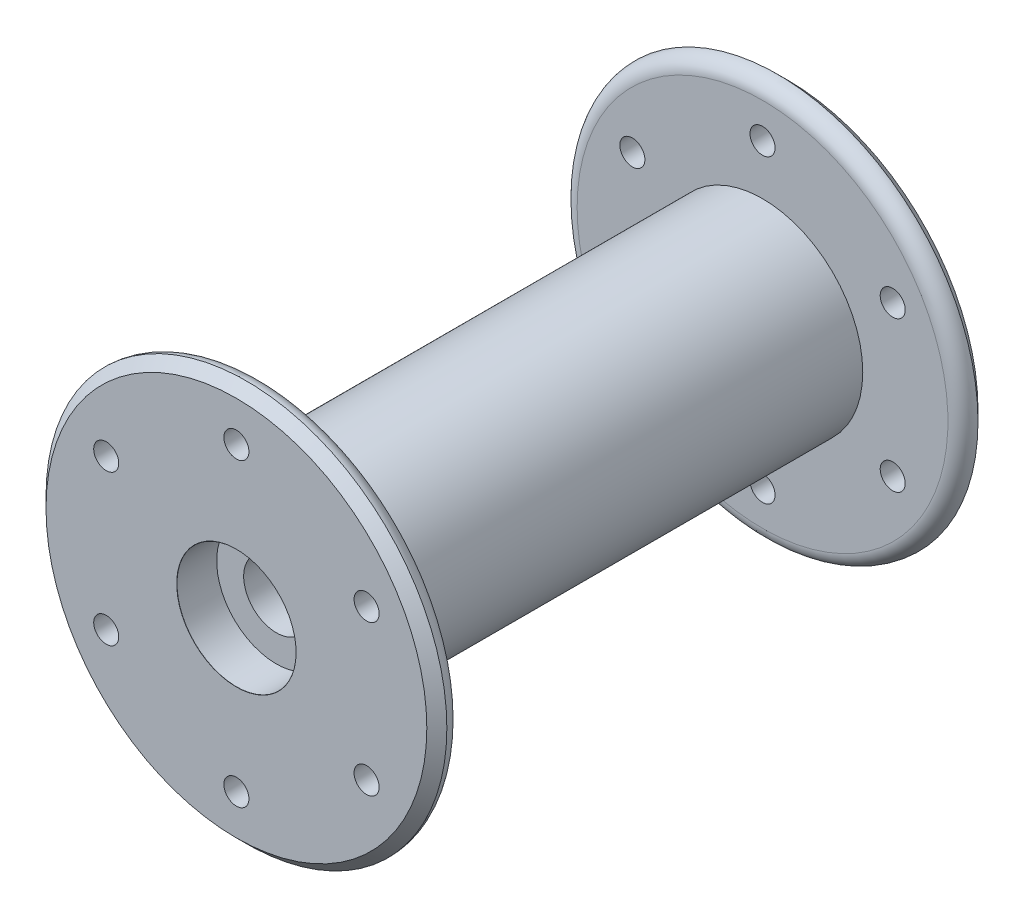
ISO-10303-21;
HEADER;
FILE_DESCRIPTION(('STEP AP214'),'2;1');
FILE_NAME('part.step','',(''),(''),'','','');
FILE_SCHEMA(('AUTOMOTIVE_DESIGN { 1 0 10303 214 1 1 1 1 }'));
ENDSEC;
DATA;
#1=APPLICATION_CONTEXT('core data for automotive mechanical design processes');
#2=APPLICATION_PROTOCOL_DEFINITION('international standard','automotive_design',2000,#1);
#3=PRODUCT_CONTEXT('',#1,'mechanical');
#4=PRODUCT('Part','Part','',(#3));
#5=PRODUCT_RELATED_PRODUCT_CATEGORY('part','',(#4));
#6=PRODUCT_DEFINITION_FORMATION('','',#4);
#7=PRODUCT_DEFINITION_CONTEXT('part definition',#1,'design');
#8=PRODUCT_DEFINITION('design','',#6,#7);
#9=PRODUCT_DEFINITION_SHAPE('','',#8);
#10=(LENGTH_UNIT() NAMED_UNIT(*) SI_UNIT(.MILLI.,.METRE.));
#11=(NAMED_UNIT(*) PLANE_ANGLE_UNIT() SI_UNIT($,.RADIAN.));
#12=(NAMED_UNIT(*) SI_UNIT($,.STERADIAN.) SOLID_ANGLE_UNIT());
#13=UNCERTAINTY_MEASURE_WITH_UNIT(LENGTH_MEASURE(1.E-05),#10,'distance_accuracy_value','');
#14=(GEOMETRIC_REPRESENTATION_CONTEXT(3) GLOBAL_UNCERTAINTY_ASSIGNED_CONTEXT((#13)) GLOBAL_UNIT_ASSIGNED_CONTEXT((#10,
#11,#12)) REPRESENTATION_CONTEXT('',''));
#15=CARTESIAN_POINT('',(0.,0.,0.));
#16=DIRECTION('',(0.,0.,1.));
#17=DIRECTION('',(1.,0.,0.));
#18=AXIS2_PLACEMENT_3D('',#15,#16,#17);
#19=CARTESIAN_POINT('',(0.,0.,50.));
#20=DIRECTION('',(0.,0.,-1.));
#21=DIRECTION('',(-1.,0.,0.));
#22=AXIS2_PLACEMENT_3D('',#19,#20,#21);
#23=CYLINDRICAL_SURFACE('',#22,20.);
#24=CARTESIAN_POINT('',(0.,0.,50.));
#25=DIRECTION('',(0.,0.,1.));
#26=DIRECTION('',(1.,0.,0.));
#27=AXIS2_PLACEMENT_3D('',#24,#25,#26);
#28=CIRCLE('',#27,20.);
#29=CARTESIAN_POINT('',(20.,0.,50.));
#30=VERTEX_POINT('',#29);
#31=EDGE_CURVE('E88',#30,#30,#28,.T.);
#32=ORIENTED_EDGE('',*,*,#31,.F.);
#33=EDGE_LOOP('',(#32));
#34=FACE_BOUND('',#33,.T.);
#35=CARTESIAN_POINT('',(0.,0.,-50.));
#36=DIRECTION('',(0.,0.,1.));
#37=DIRECTION('',(1.,0.,0.));
#38=AXIS2_PLACEMENT_3D('',#35,#36,#37);
#39=CIRCLE('',#38,20.);
#40=CARTESIAN_POINT('',(20.,0.,-50.));
#41=VERTEX_POINT('',#40);
#42=EDGE_CURVE('E96',#41,#41,#39,.T.);
#43=ORIENTED_EDGE('',*,*,#42,.T.);
#44=EDGE_LOOP('',(#43));
#45=FACE_BOUND('',#44,.T.);
#46=ADVANCED_FACE('F37',(#34,#45),#23,.T.);
#47=CARTESIAN_POINT('',(0.,0.,55.));
#48=DIRECTION('',(0.,0.,1.));
#49=DIRECTION('',(1.,0.,0.));
#50=AXIS2_PLACEMENT_3D('',#47,#48,#49);
#51=PLANE('',#50);
#52=CARTESIAN_POINT('',(0.,0.,55.));
#53=DIRECTION('',(0.,0.,1.));
#54=DIRECTION('',(1.,0.,0.));
#55=AXIS2_PLACEMENT_3D('',#52,#53,#54);
#56=CIRCLE('',#55,11.915);
#57=CARTESIAN_POINT('',(11.915,0.,55.));
#58=VERTEX_POINT('',#57);
#59=EDGE_CURVE('E100',#58,#58,#56,.T.);
#60=ORIENTED_EDGE('',*,*,#59,.F.);
#61=EDGE_LOOP('',(#60));
#62=FACE_BOUND('',#61,.T.);
#63=CARTESIAN_POINT('',(25.980762113533,15.0000000000003,55.));
#64=DIRECTION('',(0.,0.,1.));
#65=DIRECTION('',(0.50000000000001,-0.866025403784433,0.));
#66=AXIS2_PLACEMENT_3D('',#63,#64,#65);
#67=CIRCLE('',#66,2.5);
#68=CARTESIAN_POINT('',(27.230762113533,12.8349364905392,55.));
#69=VERTEX_POINT('',#68);
#70=EDGE_CURVE('E112',#69,#69,#67,.T.);
#71=ORIENTED_EDGE('',*,*,#70,.F.);
#72=EDGE_LOOP('',(#71));
#73=FACE_BOUND('',#72,.T.);
#74=CARTESIAN_POINT('',(25.9807621135333,-14.9999999999998,55.));
#75=DIRECTION('',(0.,0.,1.));
#76=DIRECTION('',(-0.499999999999992,-0.866025403784443,0.));
#77=AXIS2_PLACEMENT_3D('',#74,#75,#76);
#78=CIRCLE('',#77,2.5);
#79=CARTESIAN_POINT('',(24.7307621135333,-17.1650635094609,55.));
#80=VERTEX_POINT('',#79);
#81=EDGE_CURVE('E116',#80,#80,#78,.T.);
#82=ORIENTED_EDGE('',*,*,#81,.F.);
#83=EDGE_LOOP('',(#82));
#84=FACE_BOUND('',#83,.T.);
#85=CARTESIAN_POINT('',(0.,-30.,55.));
#86=DIRECTION('',(0.,0.,1.));
#87=DIRECTION('',(-1.,0.,0.));
#88=AXIS2_PLACEMENT_3D('',#85,#86,#87);
#89=CIRCLE('',#88,2.5);
#90=CARTESIAN_POINT('',(-2.5,-30.,55.));
#91=VERTEX_POINT('',#90);
#92=EDGE_CURVE('E121',#91,#91,#89,.T.);
#93=ORIENTED_EDGE('',*,*,#92,.F.);
#94=EDGE_LOOP('',(#93));
#95=FACE_BOUND('',#94,.T.);
#96=CARTESIAN_POINT('',(-25.9807621135331,-15.0000000000001,55.));
#97=DIRECTION('',(0.,0.,1.));
#98=DIRECTION('',(-0.500000000000004,0.866025403784436,0.));
#99=AXIS2_PLACEMENT_3D('',#96,#97,#98);
#100=CIRCLE('',#99,2.5);
#101=CARTESIAN_POINT('',(-27.2307621135331,-12.834936490539,55.));
#102=VERTEX_POINT('',#101);
#103=EDGE_CURVE('E111',#102,#102,#100,.T.);
#104=ORIENTED_EDGE('',*,*,#103,.F.);
#105=EDGE_LOOP('',(#104));
#106=FACE_BOUND('',#105,.T.);
#107=CARTESIAN_POINT('',(-25.9807621135332,14.9999999999999,55.));
#108=DIRECTION('',(0.,0.,1.));
#109=DIRECTION('',(0.499999999999998,0.86602540378444,0.));
#110=AXIS2_PLACEMENT_3D('',#107,#108,#109);
#111=CIRCLE('',#110,2.5);
#112=CARTESIAN_POINT('',(-24.7307621135332,17.165063509461,55.));
#113=VERTEX_POINT('',#112);
#114=EDGE_CURVE('E83',#113,#113,#111,.T.);
#115=ORIENTED_EDGE('',*,*,#114,.F.);
#116=EDGE_LOOP('',(#115));
#117=FACE_BOUND('',#116,.T.);
#118=CARTESIAN_POINT('',(0.,30.,55.));
#119=DIRECTION('',(0.,0.,1.));
#120=DIRECTION('',(1.,0.,0.));
#121=AXIS2_PLACEMENT_3D('',#118,#119,#120);
#122=CIRCLE('',#121,2.5);
#123=CARTESIAN_POINT('',(2.5,30.,55.));
#124=VERTEX_POINT('',#123);
#125=EDGE_CURVE('E66',#124,#124,#122,.T.);
#126=ORIENTED_EDGE('',*,*,#125,.F.);
#127=EDGE_LOOP('',(#126));
#128=FACE_BOUND('',#127,.T.);
#129=CARTESIAN_POINT('',(0.,0.,55.));
#130=DIRECTION('',(0.,0.,1.));
#131=DIRECTION('',(1.,0.,0.));
#132=AXIS2_PLACEMENT_3D('',#129,#130,#131);
#133=CIRCLE('',#132,38.);
#134=CARTESIAN_POINT('',(38.,0.,55.));
#135=VERTEX_POINT('',#134);
#136=EDGE_CURVE('E92',#135,#135,#133,.T.);
#137=ORIENTED_EDGE('',*,*,#136,.T.);
#138=EDGE_LOOP('',(#137));
#139=FACE_BOUND('',#138,.T.);
#140=ADVANCED_FACE('F240',(#62,#73,#84,#95,#106,#117,#128,#139),#51,.T.);
#141=CARTESIAN_POINT('',(0.,0.,50.));
#142=DIRECTION('',(0.,0.,1.));
#143=DIRECTION('',(1.,0.,0.));
#144=AXIS2_PLACEMENT_3D('',#141,#142,#143);
#145=PLANE('',#144);
#146=CARTESIAN_POINT('',(0.,0.,50.));
#147=DIRECTION('',(0.,0.,1.));
#148=DIRECTION('',(1.,0.,0.));
#149=AXIS2_PLACEMENT_3D('',#146,#147,#148);
#150=CIRCLE('',#149,37.);
#151=CARTESIAN_POINT('',(37.,0.,50.));
#152=VERTEX_POINT('',#151);
#153=EDGE_CURVE('E55',#152,#152,#150,.F.);
#154=ORIENTED_EDGE('',*,*,#153,.T.);
#155=EDGE_LOOP('',(#154));
#156=FACE_BOUND('',#155,.T.);
#157=CARTESIAN_POINT('',(25.980762113533,15.0000000000003,50.));
#158=DIRECTION('',(0.,0.,1.));
#159=DIRECTION('',(1.,0.,0.));
#160=AXIS2_PLACEMENT_3D('',#157,#158,#159);
#161=CIRCLE('',#160,2.5);
#162=CARTESIAN_POINT('',(28.480762113533,15.0000000000003,50.));
#163=VERTEX_POINT('',#162);
#164=EDGE_CURVE('E62',#163,#163,#161,.T.);
#165=ORIENTED_EDGE('',*,*,#164,.T.);
#166=EDGE_LOOP('',(#165));
#167=FACE_BOUND('',#166,.T.);
#168=CARTESIAN_POINT('',(25.9807621135333,-14.9999999999998,50.));
#169=DIRECTION('',(0.,0.,1.));
#170=DIRECTION('',(1.,0.,0.));
#171=AXIS2_PLACEMENT_3D('',#168,#169,#170);
#172=CIRCLE('',#171,2.5);
#173=CARTESIAN_POINT('',(28.4807621135333,-14.9999999999998,50.));
#174=VERTEX_POINT('',#173);
#175=EDGE_CURVE('E67',#174,#174,#172,.T.);
#176=ORIENTED_EDGE('',*,*,#175,.T.);
#177=EDGE_LOOP('',(#176));
#178=FACE_BOUND('',#177,.T.);
#179=CARTESIAN_POINT('',(0.,-30.,50.));
#180=DIRECTION('',(0.,0.,1.));
#181=DIRECTION('',(1.,0.,0.));
#182=AXIS2_PLACEMENT_3D('',#179,#180,#181);
#183=CIRCLE('',#182,2.5);
#184=CARTESIAN_POINT('',(2.5,-30.,50.));
#185=VERTEX_POINT('',#184);
#186=EDGE_CURVE('E71',#185,#185,#183,.T.);
#187=ORIENTED_EDGE('',*,*,#186,.T.);
#188=EDGE_LOOP('',(#187));
#189=FACE_BOUND('',#188,.T.);
#190=CARTESIAN_POINT('',(-25.9807621135331,-15.0000000000001,50.));
#191=DIRECTION('',(0.,0.,1.));
#192=DIRECTION('',(1.,0.,0.));
#193=AXIS2_PLACEMENT_3D('',#190,#191,#192);
#194=CIRCLE('',#193,2.5);
#195=CARTESIAN_POINT('',(-23.4807621135331,-15.0000000000001,50.));
#196=VERTEX_POINT('',#195);
#197=EDGE_CURVE('E75',#196,#196,#194,.T.);
#198=ORIENTED_EDGE('',*,*,#197,.T.);
#199=EDGE_LOOP('',(#198));
#200=FACE_BOUND('',#199,.T.);
#201=CARTESIAN_POINT('',(-25.9807621135332,14.9999999999999,50.));
#202=DIRECTION('',(0.,0.,1.));
#203=DIRECTION('',(1.,0.,0.));
#204=AXIS2_PLACEMENT_3D('',#201,#202,#203);
#205=CIRCLE('',#204,2.5);
#206=CARTESIAN_POINT('',(-23.4807621135332,14.9999999999999,50.));
#207=VERTEX_POINT('',#206);
#208=EDGE_CURVE('E79',#207,#207,#205,.T.);
#209=ORIENTED_EDGE('',*,*,#208,.T.);
#210=EDGE_LOOP('',(#209));
#211=FACE_BOUND('',#210,.T.);
#212=CARTESIAN_POINT('',(0.,30.,50.));
#213=DIRECTION('',(0.,0.,1.));
#214=DIRECTION('',(1.,0.,0.));
#215=AXIS2_PLACEMENT_3D('',#212,#213,#214);
#216=CIRCLE('',#215,2.5);
#217=CARTESIAN_POINT('',(2.5,30.,50.));
#218=VERTEX_POINT('',#217);
#219=EDGE_CURVE('E84',#218,#218,#216,.T.);
#220=ORIENTED_EDGE('',*,*,#219,.T.);
#221=EDGE_LOOP('',(#220));
#222=FACE_BOUND('',#221,.T.);
#223=ORIENTED_EDGE('',*,*,#31,.T.);
#224=EDGE_LOOP('',(#223));
#225=FACE_BOUND('',#224,.T.);
#226=ADVANCED_FACE('F246',(#156,#167,#178,#189,#200,#211,#222,#225),#145,.F.);
#227=CARTESIAN_POINT('',(0.,0.,55.));
#228=DIRECTION('',(0.,0.,-1.));
#229=DIRECTION('',(-1.,0.,0.));
#230=AXIS2_PLACEMENT_3D('',#227,#228,#229);
#231=CONICAL_SURFACE('',#230,38.,0.78539816339744);
#232=CARTESIAN_POINT('',(0.,0.,53.));
#233=DIRECTION('',(0.,0.,1.));
#234=DIRECTION('',(1.,0.,0.));
#235=AXIS2_PLACEMENT_3D('',#232,#233,#234);
#236=CIRCLE('',#235,40.);
#237=CARTESIAN_POINT('',(40.,0.,53.));
#238=VERTEX_POINT('',#237);
#239=EDGE_CURVE('E61',#238,#238,#236,.F.);
#240=ORIENTED_EDGE('',*,*,#239,.F.);
#241=EDGE_LOOP('',(#240));
#242=FACE_BOUND('',#241,.T.);
#243=ORIENTED_EDGE('',*,*,#136,.F.);
#244=EDGE_LOOP('',(#243));
#245=FACE_BOUND('',#244,.T.);
#246=ADVANCED_FACE('F252',(#242,#245),#231,.T.);
#247=CARTESIAN_POINT('',(0.,30.,-50.));
#248=DIRECTION('',(0.,0.,1.));
#249=DIRECTION('',(1.,0.,0.));
#250=AXIS2_PLACEMENT_3D('',#247,#248,#249);
#251=CYLINDRICAL_SURFACE('',#250,2.5);
#252=ORIENTED_EDGE('',*,*,#125,.T.);
#253=EDGE_LOOP('',(#252));
#254=FACE_BOUND('',#253,.T.);
#255=ORIENTED_EDGE('',*,*,#219,.F.);
#256=EDGE_LOOP('',(#255));
#257=FACE_BOUND('',#256,.T.);
#258=ADVANCED_FACE('F255',(#254,#257),#251,.F.);
#259=CARTESIAN_POINT('',(-25.9807621135332,14.9999999999999,-50.));
#260=DIRECTION('',(0.,0.,1.));
#261=DIRECTION('',(1.,0.,0.));
#262=AXIS2_PLACEMENT_3D('',#259,#260,#261);
#263=CYLINDRICAL_SURFACE('',#262,2.5);
#264=ORIENTED_EDGE('',*,*,#114,.T.);
#265=EDGE_LOOP('',(#264));
#266=FACE_BOUND('',#265,.T.);
#267=ORIENTED_EDGE('',*,*,#208,.F.);
#268=EDGE_LOOP('',(#267));
#269=FACE_BOUND('',#268,.T.);
#270=ADVANCED_FACE('F320',(#266,#269),#263,.F.);
#271=CARTESIAN_POINT('',(-25.9807621135331,-15.0000000000001,-50.));
#272=DIRECTION('',(0.,0.,1.));
#273=DIRECTION('',(1.,0.,0.));
#274=AXIS2_PLACEMENT_3D('',#271,#272,#273);
#275=CYLINDRICAL_SURFACE('',#274,2.5);
#276=ORIENTED_EDGE('',*,*,#103,.T.);
#277=EDGE_LOOP('',(#276));
#278=FACE_BOUND('',#277,.T.);
#279=ORIENTED_EDGE('',*,*,#197,.F.);
#280=EDGE_LOOP('',(#279));
#281=FACE_BOUND('',#280,.T.);
#282=ADVANCED_FACE('F316',(#278,#281),#275,.F.);
#283=CARTESIAN_POINT('',(0.,-30.,-50.));
#284=DIRECTION('',(0.,0.,1.));
#285=DIRECTION('',(1.,0.,0.));
#286=AXIS2_PLACEMENT_3D('',#283,#284,#285);
#287=CYLINDRICAL_SURFACE('',#286,2.5);
#288=ORIENTED_EDGE('',*,*,#92,.T.);
#289=EDGE_LOOP('',(#288));
#290=FACE_BOUND('',#289,.T.);
#291=ORIENTED_EDGE('',*,*,#186,.F.);
#292=EDGE_LOOP('',(#291));
#293=FACE_BOUND('',#292,.T.);
#294=ADVANCED_FACE('F319',(#290,#293),#287,.F.);
#295=CARTESIAN_POINT('',(25.9807621135333,-14.9999999999998,-50.));
#296=DIRECTION('',(0.,0.,1.));
#297=DIRECTION('',(1.,0.,0.));
#298=AXIS2_PLACEMENT_3D('',#295,#296,#297);
#299=CYLINDRICAL_SURFACE('',#298,2.5);
#300=ORIENTED_EDGE('',*,*,#81,.T.);
#301=EDGE_LOOP('',(#300));
#302=FACE_BOUND('',#301,.T.);
#303=ORIENTED_EDGE('',*,*,#175,.F.);
#304=EDGE_LOOP('',(#303));
#305=FACE_BOUND('',#304,.T.);
#306=ADVANCED_FACE('F324',(#302,#305),#299,.F.);
#307=CARTESIAN_POINT('',(25.980762113533,15.0000000000003,-50.));
#308=DIRECTION('',(0.,0.,1.));
#309=DIRECTION('',(1.,0.,0.));
#310=AXIS2_PLACEMENT_3D('',#307,#308,#309);
#311=CYLINDRICAL_SURFACE('',#310,2.5);
#312=ORIENTED_EDGE('',*,*,#70,.T.);
#313=EDGE_LOOP('',(#312));
#314=FACE_BOUND('',#313,.T.);
#315=ORIENTED_EDGE('',*,*,#164,.F.);
#316=EDGE_LOOP('',(#315));
#317=FACE_BOUND('',#316,.T.);
#318=ADVANCED_FACE('F260',(#314,#317),#311,.F.);
#319=CARTESIAN_POINT('',(0.,0.,53.));
#320=DIRECTION('',(0.,0.,1.));
#321=DIRECTION('',(1.,0.,0.));
#322=AXIS2_PLACEMENT_3D('',#319,#320,#321);
#323=TOROIDAL_SURFACE('',#322,37.,3.);
#324=ORIENTED_EDGE('',*,*,#153,.F.);
#325=EDGE_LOOP('',(#324));
#326=FACE_BOUND('',#325,.T.);
#327=ORIENTED_EDGE('',*,*,#239,.T.);
#328=EDGE_LOOP('',(#327));
#329=FACE_BOUND('',#328,.T.);
#330=ADVANCED_FACE('F257',(#326,#329),#323,.T.);
#331=CARTESIAN_POINT('',(0.,0.,55.));
#332=DIRECTION('',(0.,0.,1.));
#333=DIRECTION('',(1.,0.,0.));
#334=AXIS2_PLACEMENT_3D('',#331,#332,#333);
#335=CYLINDRICAL_SURFACE('',#334,6.49999999999999);
#336=CARTESIAN_POINT('',(0.,0.,-47.05));
#337=DIRECTION('',(0.,0.,-1.));
#338=DIRECTION('',(-1.,0.,0.));
#339=AXIS2_PLACEMENT_3D('',#336,#337,#338);
#340=CIRCLE('',#339,6.5);
#341=CARTESIAN_POINT('',(-6.5,0.,-47.05));
#342=VERTEX_POINT('',#341);
#343=EDGE_CURVE('E189',#342,#342,#340,.T.);
#344=ORIENTED_EDGE('',*,*,#343,.T.);
#345=EDGE_LOOP('',(#344));
#346=FACE_BOUND('',#345,.T.);
#347=CARTESIAN_POINT('',(0.,0.,47.05));
#348=DIRECTION('',(0.,0.,1.));
#349=DIRECTION('',(1.,0.,0.));
#350=AXIS2_PLACEMENT_3D('',#347,#348,#349);
#351=CIRCLE('',#350,6.5);
#352=CARTESIAN_POINT('',(6.5,0.,47.05));
#353=VERTEX_POINT('',#352);
#354=EDGE_CURVE('E117',#353,#353,#351,.T.);
#355=ORIENTED_EDGE('',*,*,#354,.T.);
#356=EDGE_LOOP('',(#355));
#357=FACE_BOUND('',#356,.T.);
#358=ADVANCED_FACE('F259',(#346,#357),#335,.F.);
#359=CARTESIAN_POINT('',(11.89,0.,47.05));
#360=DIRECTION('',(0.,0.,-1.));
#361=DIRECTION('',(-1.,0.,0.));
#362=AXIS2_PLACEMENT_3D('',#359,#360,#361);
#363=PLANE('',#362);
#364=ORIENTED_EDGE('',*,*,#354,.F.);
#365=EDGE_LOOP('',(#364));
#366=FACE_BOUND('',#365,.T.);
#367=CARTESIAN_POINT('',(0.,0.,47.05));
#368=DIRECTION('',(0.,0.,1.));
#369=DIRECTION('',(1.,0.,0.));
#370=AXIS2_PLACEMENT_3D('',#367,#368,#369);
#371=CIRCLE('',#370,11.89);
#372=CARTESIAN_POINT('',(11.89,0.,47.05));
#373=VERTEX_POINT('',#372);
#374=EDGE_CURVE('E131',#373,#373,#371,.T.);
#375=ORIENTED_EDGE('',*,*,#374,.T.);
#376=EDGE_LOOP('',(#375));
#377=FACE_BOUND('',#376,.T.);
#378=ADVANCED_FACE('F308',(#366,#377),#363,.F.);
#379=CARTESIAN_POINT('',(0.,0.,55.));
#380=DIRECTION('',(0.,0.,1.));
#381=DIRECTION('',(1.,0.,0.));
#382=AXIS2_PLACEMENT_3D('',#379,#380,#381);
#383=CYLINDRICAL_SURFACE('',#382,11.89);
#384=ORIENTED_EDGE('',*,*,#374,.F.);
#385=EDGE_LOOP('',(#384));
#386=FACE_BOUND('',#385,.T.);
#387=CARTESIAN_POINT('',(0.,0.,54.975));
#388=DIRECTION('',(0.,0.,1.));
#389=DIRECTION('',(1.,0.,0.));
#390=AXIS2_PLACEMENT_3D('',#387,#388,#389);
#391=CIRCLE('',#390,11.89);
#392=CARTESIAN_POINT('',(11.89,0.,54.975));
#393=VERTEX_POINT('',#392);
#394=EDGE_CURVE('E135',#393,#393,#391,.T.);
#395=ORIENTED_EDGE('',*,*,#394,.T.);
#396=EDGE_LOOP('',(#395));
#397=FACE_BOUND('',#396,.T.);
#398=ADVANCED_FACE('F304',(#386,#397),#383,.F.);
#399=CARTESIAN_POINT('',(0.,0.,55.));
#400=DIRECTION('',(0.,0.,1.));
#401=DIRECTION('',(1.,0.,0.));
#402=AXIS2_PLACEMENT_3D('',#399,#400,#401);
#403=CONICAL_SURFACE('',#402,11.915,0.785398163397414);
#404=ORIENTED_EDGE('',*,*,#394,.F.);
#405=EDGE_LOOP('',(#404));
#406=FACE_BOUND('',#405,.T.);
#407=ORIENTED_EDGE('',*,*,#59,.T.);
#408=EDGE_LOOP('',(#407));
#409=FACE_BOUND('',#408,.T.);
#410=ADVANCED_FACE('F235',(#406,#409),#403,.F.);
#411=CARTESIAN_POINT('',(0.,0.,-50.));
#412=DIRECTION('',(0.,0.,-1.));
#413=DIRECTION('',(1.,0.,0.));
#414=AXIS2_PLACEMENT_3D('',#411,#412,#413);
#415=PLANE('',#414);
#416=CARTESIAN_POINT('',(0.,0.,-50.));
#417=DIRECTION('',(0.,0.,-1.));
#418=DIRECTION('',(-1.,0.,0.));
#419=AXIS2_PLACEMENT_3D('',#416,#417,#418);
#420=CIRCLE('',#419,37.);
#421=CARTESIAN_POINT('',(-37.,0.,-50.));
#422=VERTEX_POINT('',#421);
#423=EDGE_CURVE('E10',#422,#422,#420,.F.);
#424=ORIENTED_EDGE('',*,*,#423,.T.);
#425=EDGE_LOOP('',(#424));
#426=FACE_BOUND('',#425,.T.);
#427=CARTESIAN_POINT('',(25.980762113533,15.0000000000003,-50.));
#428=DIRECTION('',(0.,0.,-1.));
#429=DIRECTION('',(-1.,0.,0.));
#430=AXIS2_PLACEMENT_3D('',#427,#428,#429);
#431=CIRCLE('',#430,2.5);
#432=CARTESIAN_POINT('',(23.480762113533,15.0000000000003,-50.));
#433=VERTEX_POINT('',#432);
#434=EDGE_CURVE('E149',#433,#433,#431,.F.);
#435=ORIENTED_EDGE('',*,*,#434,.F.);
#436=EDGE_LOOP('',(#435));
#437=FACE_BOUND('',#436,.T.);
#438=CARTESIAN_POINT('',(25.9807621135333,-14.9999999999998,-50.));
#439=DIRECTION('',(0.,0.,-1.));
#440=DIRECTION('',(-1.,0.,0.));
#441=AXIS2_PLACEMENT_3D('',#438,#439,#440);
#442=CIRCLE('',#441,2.5);
#443=CARTESIAN_POINT('',(23.4807621135333,-14.9999999999998,-50.));
#444=VERTEX_POINT('',#443);
#445=EDGE_CURVE('E153',#444,#444,#442,.F.);
#446=ORIENTED_EDGE('',*,*,#445,.F.);
#447=EDGE_LOOP('',(#446));
#448=FACE_BOUND('',#447,.T.);
#449=CARTESIAN_POINT('',(0.,-30.,-50.));
#450=DIRECTION('',(0.,0.,-1.));
#451=DIRECTION('',(-1.,0.,0.));
#452=AXIS2_PLACEMENT_3D('',#449,#450,#451);
#453=CIRCLE('',#452,2.5);
#454=CARTESIAN_POINT('',(-2.5,-30.,-50.));
#455=VERTEX_POINT('',#454);
#456=EDGE_CURVE('E157',#455,#455,#453,.F.);
#457=ORIENTED_EDGE('',*,*,#456,.F.);
#458=EDGE_LOOP('',(#457));
#459=FACE_BOUND('',#458,.T.);
#460=CARTESIAN_POINT('',(-25.9807621135331,-15.0000000000001,-50.));
#461=DIRECTION('',(0.,0.,-1.));
#462=DIRECTION('',(-1.,0.,0.));
#463=AXIS2_PLACEMENT_3D('',#460,#461,#462);
#464=CIRCLE('',#463,2.5);
#465=CARTESIAN_POINT('',(-28.4807621135331,-15.0000000000001,-50.));
#466=VERTEX_POINT('',#465);
#467=EDGE_CURVE('E161',#466,#466,#464,.F.);
#468=ORIENTED_EDGE('',*,*,#467,.F.);
#469=EDGE_LOOP('',(#468));
#470=FACE_BOUND('',#469,.T.);
#471=CARTESIAN_POINT('',(-25.9807621135332,14.9999999999999,-50.));
#472=DIRECTION('',(0.,0.,-1.));
#473=DIRECTION('',(-1.,0.,0.));
#474=AXIS2_PLACEMENT_3D('',#471,#472,#473);
#475=CIRCLE('',#474,2.5);
#476=CARTESIAN_POINT('',(-28.4807621135332,14.9999999999999,-50.));
#477=VERTEX_POINT('',#476);
#478=EDGE_CURVE('E165',#477,#477,#475,.F.);
#479=ORIENTED_EDGE('',*,*,#478,.F.);
#480=EDGE_LOOP('',(#479));
#481=FACE_BOUND('',#480,.T.);
#482=CARTESIAN_POINT('',(0.,30.,-50.));
#483=DIRECTION('',(0.,0.,-1.));
#484=DIRECTION('',(-1.,0.,0.));
#485=AXIS2_PLACEMENT_3D('',#482,#483,#484);
#486=CIRCLE('',#485,2.5);
#487=CARTESIAN_POINT('',(-2.5,30.,-50.));
#488=VERTEX_POINT('',#487);
#489=EDGE_CURVE('E101',#488,#488,#486,.F.);
#490=ORIENTED_EDGE('',*,*,#489,.F.);
#491=EDGE_LOOP('',(#490));
#492=FACE_BOUND('',#491,.T.);
#493=ORIENTED_EDGE('',*,*,#42,.F.);
#494=EDGE_LOOP('',(#493));
#495=FACE_BOUND('',#494,.T.);
#496=ADVANCED_FACE('F212',(#426,#437,#448,#459,#470,#481,#492,#495),#415,.F.);
#497=CARTESIAN_POINT('',(0.,0.,-55.));
#498=DIRECTION('',(0.,0.,-1.));
#499=DIRECTION('',(1.,0.,0.));
#500=AXIS2_PLACEMENT_3D('',#497,#498,#499);
#501=PLANE('',#500);
#502=CARTESIAN_POINT('',(0.,0.,-55.));
#503=DIRECTION('',(0.,0.,-1.));
#504=DIRECTION('',(-1.,0.,0.));
#505=AXIS2_PLACEMENT_3D('',#502,#503,#504);
#506=CIRCLE('',#505,11.915);
#507=CARTESIAN_POINT('',(-11.915,0.,-55.));
#508=VERTEX_POINT('',#507);
#509=EDGE_CURVE('E201',#508,#508,#506,.T.);
#510=ORIENTED_EDGE('',*,*,#509,.F.);
#511=EDGE_LOOP('',(#510));
#512=FACE_BOUND('',#511,.T.);
#513=CARTESIAN_POINT('',(25.980762113533,15.0000000000003,-55.));
#514=DIRECTION('',(0.,0.,1.));
#515=DIRECTION('',(0.50000000000001,-0.866025403784433,0.));
#516=AXIS2_PLACEMENT_3D('',#513,#514,#515);
#517=CIRCLE('',#516,2.5);
#518=CARTESIAN_POINT('',(27.230762113533,12.8349364905392,-55.));
#519=VERTEX_POINT('',#518);
#520=EDGE_CURVE('E175',#519,#519,#517,.T.);
#521=ORIENTED_EDGE('',*,*,#520,.T.);
#522=EDGE_LOOP('',(#521));
#523=FACE_BOUND('',#522,.T.);
#524=CARTESIAN_POINT('',(25.9807621135333,-14.9999999999998,-55.));
#525=DIRECTION('',(0.,0.,1.));
#526=DIRECTION('',(-0.499999999999992,-0.866025403784443,0.));
#527=AXIS2_PLACEMENT_3D('',#524,#525,#526);
#528=CIRCLE('',#527,2.5);
#529=CARTESIAN_POINT('',(24.7307621135333,-17.1650635094609,-55.));
#530=VERTEX_POINT('',#529);
#531=EDGE_CURVE('E170',#530,#530,#528,.T.);
#532=ORIENTED_EDGE('',*,*,#531,.T.);
#533=EDGE_LOOP('',(#532));
#534=FACE_BOUND('',#533,.T.);
#535=CARTESIAN_POINT('',(0.,-30.,-55.));
#536=DIRECTION('',(0.,0.,1.));
#537=DIRECTION('',(-1.,0.,0.));
#538=AXIS2_PLACEMENT_3D('',#535,#536,#537);
#539=CIRCLE('',#538,2.5);
#540=CARTESIAN_POINT('',(-2.5,-30.,-55.));
#541=VERTEX_POINT('',#540);
#542=EDGE_CURVE('E174',#541,#541,#539,.T.);
#543=ORIENTED_EDGE('',*,*,#542,.T.);
#544=EDGE_LOOP('',(#543));
#545=FACE_BOUND('',#544,.T.);
#546=CARTESIAN_POINT('',(-25.9807621135331,-15.0000000000001,-55.));
#547=DIRECTION('',(0.,0.,1.));
#548=DIRECTION('',(-0.500000000000004,0.866025403784436,0.));
#549=AXIS2_PLACEMENT_3D('',#546,#547,#548);
#550=CIRCLE('',#549,2.5);
#551=CARTESIAN_POINT('',(-27.2307621135331,-12.834936490539,-55.));
#552=VERTEX_POINT('',#551);
#553=EDGE_CURVE('E179',#552,#552,#550,.T.);
#554=ORIENTED_EDGE('',*,*,#553,.T.);
#555=EDGE_LOOP('',(#554));
#556=FACE_BOUND('',#555,.T.);
#557=CARTESIAN_POINT('',(-25.9807621135332,14.9999999999999,-55.));
#558=DIRECTION('',(0.,0.,1.));
#559=DIRECTION('',(0.499999999999998,0.86602540378444,0.));
#560=AXIS2_PLACEMENT_3D('',#557,#558,#559);
#561=CIRCLE('',#560,2.5);
#562=CARTESIAN_POINT('',(-24.7307621135332,17.165063509461,-55.));
#563=VERTEX_POINT('',#562);
#564=EDGE_CURVE('E169',#563,#563,#561,.T.);
#565=ORIENTED_EDGE('',*,*,#564,.T.);
#566=EDGE_LOOP('',(#565));
#567=FACE_BOUND('',#566,.T.);
#568=CARTESIAN_POINT('',(0.,30.,-55.));
#569=DIRECTION('',(0.,0.,1.));
#570=DIRECTION('',(1.,0.,0.));
#571=AXIS2_PLACEMENT_3D('',#568,#569,#570);
#572=CIRCLE('',#571,2.5);
#573=CARTESIAN_POINT('',(2.5,30.,-55.));
#574=VERTEX_POINT('',#573);
#575=EDGE_CURVE('E145',#574,#574,#572,.T.);
#576=ORIENTED_EDGE('',*,*,#575,.T.);
#577=EDGE_LOOP('',(#576));
#578=FACE_BOUND('',#577,.T.);
#579=CARTESIAN_POINT('',(0.,0.,-55.));
#580=DIRECTION('',(0.,0.,-1.));
#581=DIRECTION('',(-1.,0.,0.));
#582=AXIS2_PLACEMENT_3D('',#579,#580,#581);
#583=CIRCLE('',#582,38.);
#584=CARTESIAN_POINT('',(-38.,0.,-55.));
#585=VERTEX_POINT('',#584);
#586=EDGE_CURVE('E45',#585,#585,#583,.T.);
#587=ORIENTED_EDGE('',*,*,#586,.T.);
#588=EDGE_LOOP('',(#587));
#589=FACE_BOUND('',#588,.T.);
#590=ADVANCED_FACE('F208',(#512,#523,#534,#545,#556,#567,#578,#589),#501,.T.);
#591=CARTESIAN_POINT('',(0.,0.,-53.));
#592=DIRECTION('',(0.,0.,1.));
#593=DIRECTION('',(1.,0.,0.));
#594=AXIS2_PLACEMENT_3D('',#591,#592,#593);
#595=CONICAL_SURFACE('',#594,40.,0.785398163397443);
#596=ORIENTED_EDGE('',*,*,#586,.F.);
#597=EDGE_LOOP('',(#596));
#598=FACE_BOUND('',#597,.T.);
#599=CARTESIAN_POINT('',(0.,0.,-53.));
#600=DIRECTION('',(0.,0.,-1.));
#601=DIRECTION('',(-1.,0.,0.));
#602=AXIS2_PLACEMENT_3D('',#599,#600,#601);
#603=CIRCLE('',#602,40.);
#604=CARTESIAN_POINT('',(-40.,0.,-53.));
#605=VERTEX_POINT('',#604);
#606=EDGE_CURVE('E50',#605,#605,#603,.F.);
#607=ORIENTED_EDGE('',*,*,#606,.F.);
#608=EDGE_LOOP('',(#607));
#609=FACE_BOUND('',#608,.T.);
#610=ADVANCED_FACE('F211',(#598,#609),#595,.T.);
#611=CARTESIAN_POINT('',(0.,30.,55.));
#612=DIRECTION('',(0.,0.,-1.));
#613=DIRECTION('',(-1.,0.,0.));
#614=AXIS2_PLACEMENT_3D('',#611,#612,#613);
#615=CYLINDRICAL_SURFACE('',#614,2.5);
#616=ORIENTED_EDGE('',*,*,#575,.F.);
#617=EDGE_LOOP('',(#616));
#618=FACE_BOUND('',#617,.T.);
#619=ORIENTED_EDGE('',*,*,#489,.T.);
#620=EDGE_LOOP('',(#619));
#621=FACE_BOUND('',#620,.T.);
#622=ADVANCED_FACE('F226',(#618,#621),#615,.F.);
#623=CARTESIAN_POINT('',(-25.9807621135332,14.9999999999999,55.));
#624=DIRECTION('',(0.,0.,-1.));
#625=DIRECTION('',(-1.,0.,0.));
#626=AXIS2_PLACEMENT_3D('',#623,#624,#625);
#627=CYLINDRICAL_SURFACE('',#626,2.5);
#628=ORIENTED_EDGE('',*,*,#564,.F.);
#629=EDGE_LOOP('',(#628));
#630=FACE_BOUND('',#629,.T.);
#631=ORIENTED_EDGE('',*,*,#478,.T.);
#632=EDGE_LOOP('',(#631));
#633=FACE_BOUND('',#632,.T.);
#634=ADVANCED_FACE('F229',(#630,#633),#627,.F.);
#635=CARTESIAN_POINT('',(-25.9807621135331,-15.0000000000001,55.));
#636=DIRECTION('',(0.,0.,-1.));
#637=DIRECTION('',(-1.,0.,0.));
#638=AXIS2_PLACEMENT_3D('',#635,#636,#637);
#639=CYLINDRICAL_SURFACE('',#638,2.5);
#640=ORIENTED_EDGE('',*,*,#553,.F.);
#641=EDGE_LOOP('',(#640));
#642=FACE_BOUND('',#641,.T.);
#643=ORIENTED_EDGE('',*,*,#467,.T.);
#644=EDGE_LOOP('',(#643));
#645=FACE_BOUND('',#644,.T.);
#646=ADVANCED_FACE('F294',(#642,#645),#639,.F.);
#647=CARTESIAN_POINT('',(0.,-30.,55.));
#648=DIRECTION('',(0.,0.,-1.));
#649=DIRECTION('',(-1.,0.,0.));
#650=AXIS2_PLACEMENT_3D('',#647,#648,#649);
#651=CYLINDRICAL_SURFACE('',#650,2.5);
#652=ORIENTED_EDGE('',*,*,#542,.F.);
#653=EDGE_LOOP('',(#652));
#654=FACE_BOUND('',#653,.T.);
#655=ORIENTED_EDGE('',*,*,#456,.T.);
#656=EDGE_LOOP('',(#655));
#657=FACE_BOUND('',#656,.T.);
#658=ADVANCED_FACE('F286',(#654,#657),#651,.F.);
#659=CARTESIAN_POINT('',(25.9807621135333,-14.9999999999998,55.));
#660=DIRECTION('',(0.,0.,-1.));
#661=DIRECTION('',(-1.,0.,0.));
#662=AXIS2_PLACEMENT_3D('',#659,#660,#661);
#663=CYLINDRICAL_SURFACE('',#662,2.5);
#664=ORIENTED_EDGE('',*,*,#531,.F.);
#665=EDGE_LOOP('',(#664));
#666=FACE_BOUND('',#665,.T.);
#667=ORIENTED_EDGE('',*,*,#445,.T.);
#668=EDGE_LOOP('',(#667));
#669=FACE_BOUND('',#668,.T.);
#670=ADVANCED_FACE('F280',(#666,#669),#663,.F.);
#671=CARTESIAN_POINT('',(25.980762113533,15.0000000000003,55.));
#672=DIRECTION('',(0.,0.,-1.));
#673=DIRECTION('',(-1.,0.,0.));
#674=AXIS2_PLACEMENT_3D('',#671,#672,#673);
#675=CYLINDRICAL_SURFACE('',#674,2.5);
#676=ORIENTED_EDGE('',*,*,#520,.F.);
#677=EDGE_LOOP('',(#676));
#678=FACE_BOUND('',#677,.T.);
#679=ORIENTED_EDGE('',*,*,#434,.T.);
#680=EDGE_LOOP('',(#679));
#681=FACE_BOUND('',#680,.T.);
#682=ADVANCED_FACE('F272',(#678,#681),#675,.F.);
#683=CARTESIAN_POINT('',(0.,0.,-53.));
#684=DIRECTION('',(0.,0.,-1.));
#685=DIRECTION('',(-1.,0.,0.));
#686=AXIS2_PLACEMENT_3D('',#683,#684,#685);
#687=TOROIDAL_SURFACE('',#686,37.,3.);
#688=ORIENTED_EDGE('',*,*,#606,.T.);
#689=EDGE_LOOP('',(#688));
#690=FACE_BOUND('',#689,.T.);
#691=ORIENTED_EDGE('',*,*,#423,.F.);
#692=EDGE_LOOP('',(#691));
#693=FACE_BOUND('',#692,.T.);
#694=ADVANCED_FACE('F39',(#690,#693),#687,.T.);
#695=CARTESIAN_POINT('',(11.89,0.,-47.05));
#696=DIRECTION('',(0.,0.,1.));
#697=DIRECTION('',(1.,0.,0.));
#698=AXIS2_PLACEMENT_3D('',#695,#696,#697);
#699=PLANE('',#698);
#700=ORIENTED_EDGE('',*,*,#343,.F.);
#701=EDGE_LOOP('',(#700));
#702=FACE_BOUND('',#701,.T.);
#703=CARTESIAN_POINT('',(0.,0.,-47.05));
#704=DIRECTION('',(0.,0.,-1.));
#705=DIRECTION('',(-1.,0.,0.));
#706=AXIS2_PLACEMENT_3D('',#703,#704,#705);
#707=CIRCLE('',#706,11.89);
#708=CARTESIAN_POINT('',(-11.89,0.,-47.05));
#709=VERTEX_POINT('',#708);
#710=EDGE_CURVE('E193',#709,#709,#707,.T.);
#711=ORIENTED_EDGE('',*,*,#710,.T.);
#712=EDGE_LOOP('',(#711));
#713=FACE_BOUND('',#712,.T.);
#714=ADVANCED_FACE('F271',(#702,#713),#699,.F.);
#715=CARTESIAN_POINT('',(0.,0.,-55.));
#716=DIRECTION('',(0.,0.,-1.));
#717=DIRECTION('',(-1.,0.,0.));
#718=AXIS2_PLACEMENT_3D('',#715,#716,#717);
#719=CYLINDRICAL_SURFACE('',#718,11.89);
#720=ORIENTED_EDGE('',*,*,#710,.F.);
#721=EDGE_LOOP('',(#720));
#722=FACE_BOUND('',#721,.T.);
#723=CARTESIAN_POINT('',(0.,0.,-54.975));
#724=DIRECTION('',(0.,0.,-1.));
#725=DIRECTION('',(-1.,0.,0.));
#726=AXIS2_PLACEMENT_3D('',#723,#724,#725);
#727=CIRCLE('',#726,11.89);
#728=CARTESIAN_POINT('',(-11.89,0.,-54.975));
#729=VERTEX_POINT('',#728);
#730=EDGE_CURVE('E197',#729,#729,#727,.T.);
#731=ORIENTED_EDGE('',*,*,#730,.T.);
#732=EDGE_LOOP('',(#731));
#733=FACE_BOUND('',#732,.T.);
#734=ADVANCED_FACE('F277',(#722,#733),#719,.F.);
#735=CARTESIAN_POINT('',(0.,0.,-55.));
#736=DIRECTION('',(0.,0.,-1.));
#737=DIRECTION('',(-1.,0.,0.));
#738=AXIS2_PLACEMENT_3D('',#735,#736,#737);
#739=CONICAL_SURFACE('',#738,11.915,0.785398163397414);
#740=ORIENTED_EDGE('',*,*,#730,.F.);
#741=EDGE_LOOP('',(#740));
#742=FACE_BOUND('',#741,.T.);
#743=ORIENTED_EDGE('',*,*,#509,.T.);
#744=EDGE_LOOP('',(#743));
#745=FACE_BOUND('',#744,.T.);
#746=ADVANCED_FACE('F206',(#742,#745),#739,.F.);
#747=CLOSED_SHELL('',(#46,#140,#226,#246,#258,#270,#282,#294,#306,#318,#330,#358,#378,#398,#410,
#496,#590,#610,#622,#634,#646,#658,#670,#682,#694,#714,#734,#746));
#748=MANIFOLD_SOLID_BREP('B2',#747);
#749=ADVANCED_BREP_SHAPE_REPRESENTATION('',(#18,#748),#14);
#750=SHAPE_DEFINITION_REPRESENTATION(#9,#749);
ENDSEC;
END-ISO-10303-21;
